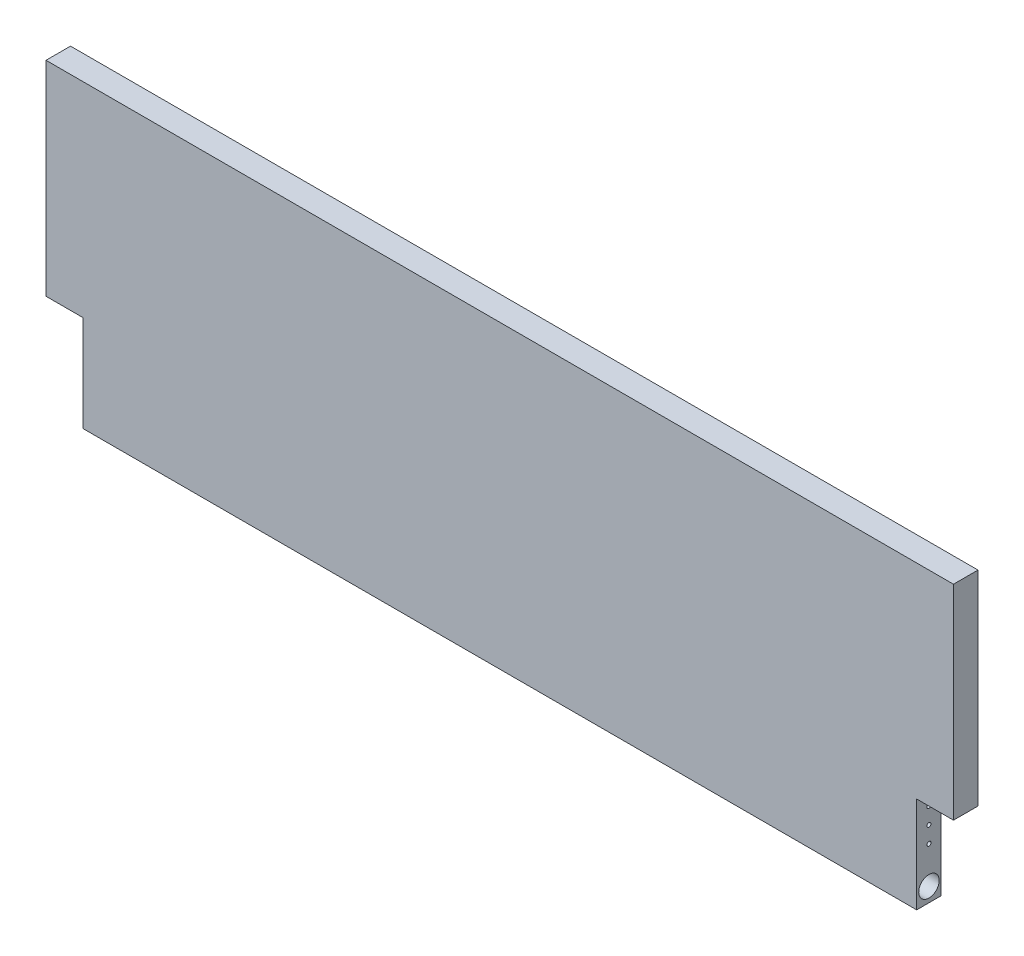
ISO-10303-21;
HEADER;
FILE_DESCRIPTION(('STEP AP214'),'2;1');
FILE_NAME('part.step','',(''),(''),'','','');
FILE_SCHEMA(('AUTOMOTIVE_DESIGN { 1 0 10303 214 1 1 1 1 }'));
ENDSEC;
DATA;
#1=APPLICATION_CONTEXT('core data for automotive mechanical design processes');
#2=APPLICATION_PROTOCOL_DEFINITION('international standard','automotive_design',2000,#1);
#3=PRODUCT_CONTEXT('',#1,'mechanical');
#4=PRODUCT('Part','Part','',(#3));
#5=PRODUCT_RELATED_PRODUCT_CATEGORY('part','',(#4));
#6=PRODUCT_DEFINITION_FORMATION('','',#4);
#7=PRODUCT_DEFINITION_CONTEXT('part definition',#1,'design');
#8=PRODUCT_DEFINITION('design','',#6,#7);
#9=PRODUCT_DEFINITION_SHAPE('','',#8);
#10=(LENGTH_UNIT() NAMED_UNIT(*) SI_UNIT(.MILLI.,.METRE.));
#11=(NAMED_UNIT(*) PLANE_ANGLE_UNIT() SI_UNIT($,.RADIAN.));
#12=(NAMED_UNIT(*) SI_UNIT($,.STERADIAN.) SOLID_ANGLE_UNIT());
#13=UNCERTAINTY_MEASURE_WITH_UNIT(LENGTH_MEASURE(1.E-05),#10,'distance_accuracy_value','');
#14=(GEOMETRIC_REPRESENTATION_CONTEXT(3) GLOBAL_UNCERTAINTY_ASSIGNED_CONTEXT((#13)) GLOBAL_UNIT_ASSIGNED_CONTEXT((#10,
#11,#12)) REPRESENTATION_CONTEXT('',''));
#15=CARTESIAN_POINT('',(0.,0.,0.));
#16=DIRECTION('',(0.,0.,1.));
#17=DIRECTION('',(1.,0.,0.));
#18=AXIS2_PLACEMENT_3D('',#15,#16,#17);
#19=CARTESIAN_POINT('',(102.,-3.5,3.));
#20=DIRECTION('',(0.,1.,0.));
#21=DIRECTION('',(0.,0.,1.));
#22=AXIS2_PLACEMENT_3D('',#19,#20,#21);
#23=PLANE('',#22);
#24=DIRECTION('',(0.,0.,-1.));
#25=VECTOR('',#24,1.);
#26=CARTESIAN_POINT('',(-102.,-3.5,3.));
#27=LINE('',#26,#25);
#28=CARTESIAN_POINT('',(-102.,-3.5,3.));
#29=VERTEX_POINT('',#28);
#30=CARTESIAN_POINT('',(-102.,-3.5,-3.));
#31=VERTEX_POINT('',#30);
#32=EDGE_CURVE('E165',#29,#31,#27,.T.);
#33=ORIENTED_EDGE('',*,*,#32,.T.);
#34=DIRECTION('',(-1.,0.,0.));
#35=VECTOR('',#34,1.);
#36=CARTESIAN_POINT('',(102.,-3.5,-3.));
#37=LINE('',#36,#35);
#38=CARTESIAN_POINT('',(102.,-3.5,-3.));
#39=VERTEX_POINT('',#38);
#40=EDGE_CURVE('E40',#39,#31,#37,.T.);
#41=ORIENTED_EDGE('',*,*,#40,.F.);
#42=DIRECTION('',(0.,0.,-1.));
#43=VECTOR('',#42,1.);
#44=CARTESIAN_POINT('',(102.,-3.5,3.));
#45=LINE('',#44,#43);
#46=CARTESIAN_POINT('',(102.,-3.5,3.));
#47=VERTEX_POINT('',#46);
#48=EDGE_CURVE('E171',#47,#39,#45,.T.);
#49=ORIENTED_EDGE('',*,*,#48,.F.);
#50=DIRECTION('',(-1.,0.,0.));
#51=VECTOR('',#50,1.);
#52=CARTESIAN_POINT('',(102.,-3.5,3.));
#53=LINE('',#52,#51);
#54=EDGE_CURVE('E11',#47,#29,#53,.T.);
#55=ORIENTED_EDGE('',*,*,#54,.T.);
#56=EDGE_LOOP('',(#33,#41,#49,#55));
#57=FACE_BOUND('',#56,.T.);
#58=ADVANCED_FACE('F33',(#57),#23,.F.);
#59=CARTESIAN_POINT('',(102.,0.,-3.));
#60=DIRECTION('',(0.,0.,1.));
#61=DIRECTION('',(0.,-1.,0.));
#62=AXIS2_PLACEMENT_3D('',#59,#60,#61);
#63=PLANE('',#62);
#64=DIRECTION('',(0.,1.,0.));
#65=VECTOR('',#64,1.);
#66=CARTESIAN_POINT('',(-102.,0.,-3.));
#67=LINE('',#66,#65);
#68=CARTESIAN_POINT('',(-102.,20.,-3.));
#69=VERTEX_POINT('',#68);
#70=EDGE_CURVE('E177',#31,#69,#67,.T.);
#71=ORIENTED_EDGE('',*,*,#70,.T.);
#72=DIRECTION('',(-1.,0.,0.));
#73=VECTOR('',#72,1.);
#74=CARTESIAN_POINT('',(-102.,20.,-3.));
#75=LINE('',#74,#73);
#76=CARTESIAN_POINT('',(-111.,20.,-3.));
#77=VERTEX_POINT('',#76);
#78=EDGE_CURVE('E55',#69,#77,#75,.T.);
#79=ORIENTED_EDGE('',*,*,#78,.T.);
#80=DIRECTION('',(0.,1.,0.));
#81=VECTOR('',#80,1.);
#82=CARTESIAN_POINT('',(-111.,70.,-2.99999999999999));
#83=LINE('',#82,#81);
#84=CARTESIAN_POINT('',(-111.,70.,-2.99999999999999));
#85=VERTEX_POINT('',#84);
#86=EDGE_CURVE('E158',#77,#85,#83,.T.);
#87=ORIENTED_EDGE('',*,*,#86,.T.);
#88=DIRECTION('',(-1.,0.,0.));
#89=VECTOR('',#88,1.);
#90=CARTESIAN_POINT('',(102.,70.,-2.99999999999999));
#91=LINE('',#90,#89);
#92=CARTESIAN_POINT('',(111.,70.,-2.99999999999999));
#93=VERTEX_POINT('',#92);
#94=EDGE_CURVE('E107',#93,#85,#91,.T.);
#95=ORIENTED_EDGE('',*,*,#94,.F.);
#96=DIRECTION('',(0.,1.,0.));
#97=VECTOR('',#96,1.);
#98=CARTESIAN_POINT('',(111.,70.,-2.99999999999999));
#99=LINE('',#98,#97);
#100=CARTESIAN_POINT('',(111.,20.,-3.));
#101=VERTEX_POINT('',#100);
#102=EDGE_CURVE('E123',#101,#93,#99,.T.);
#103=ORIENTED_EDGE('',*,*,#102,.F.);
#104=DIRECTION('',(1.,0.,0.));
#105=VECTOR('',#104,1.);
#106=CARTESIAN_POINT('',(102.,20.,-3.));
#107=LINE('',#106,#105);
#108=CARTESIAN_POINT('',(102.,20.,-3.));
#109=VERTEX_POINT('',#108);
#110=EDGE_CURVE('E118',#109,#101,#107,.T.);
#111=ORIENTED_EDGE('',*,*,#110,.F.);
#112=DIRECTION('',(0.,1.,0.));
#113=VECTOR('',#112,1.);
#114=CARTESIAN_POINT('',(102.,0.,-3.));
#115=LINE('',#114,#113);
#116=EDGE_CURVE('E108',#39,#109,#115,.T.);
#117=ORIENTED_EDGE('',*,*,#116,.F.);
#118=ORIENTED_EDGE('',*,*,#40,.T.);
#119=EDGE_LOOP('',(#71,#79,#87,#95,#103,#111,#117,#118));
#120=FACE_BOUND('',#119,.T.);
#121=ADVANCED_FACE('F185',(#120),#63,.F.);
#122=CARTESIAN_POINT('',(102.,70.,3.));
#123=DIRECTION('',(0.,-1.,0.));
#124=DIRECTION('',(0.,0.,-1.));
#125=AXIS2_PLACEMENT_3D('',#122,#123,#124);
#126=PLANE('',#125);
#127=ORIENTED_EDGE('',*,*,#94,.T.);
#128=DIRECTION('',(0.,0.,-1.));
#129=VECTOR('',#128,1.);
#130=CARTESIAN_POINT('',(-111.,70.,3.00000000000001));
#131=LINE('',#130,#129);
#132=CARTESIAN_POINT('',(-111.,70.,3.00000000000001));
#133=VERTEX_POINT('',#132);
#134=EDGE_CURVE('E103',#133,#85,#131,.T.);
#135=ORIENTED_EDGE('',*,*,#134,.F.);
#136=DIRECTION('',(-1.,0.,0.));
#137=VECTOR('',#136,1.);
#138=CARTESIAN_POINT('',(102.,70.,3.));
#139=LINE('',#138,#137);
#140=CARTESIAN_POINT('',(111.,70.,3.00000000000001));
#141=VERTEX_POINT('',#140);
#142=EDGE_CURVE('E97',#141,#133,#139,.T.);
#143=ORIENTED_EDGE('',*,*,#142,.F.);
#144=DIRECTION('',(0.,0.,-1.));
#145=VECTOR('',#144,1.);
#146=CARTESIAN_POINT('',(111.,70.,3.00000000000001));
#147=LINE('',#146,#145);
#148=EDGE_CURVE('E101',#141,#93,#147,.T.);
#149=ORIENTED_EDGE('',*,*,#148,.T.);
#150=EDGE_LOOP('',(#127,#135,#143,#149));
#151=FACE_BOUND('',#150,.T.);
#152=ADVANCED_FACE('F99',(#151),#126,.F.);
#153=CARTESIAN_POINT('',(102.,0.,3.));
#154=DIRECTION('',(0.,0.,-1.));
#155=DIRECTION('',(0.,1.,0.));
#156=AXIS2_PLACEMENT_3D('',#153,#154,#155);
#157=PLANE('',#156);
#158=ORIENTED_EDGE('',*,*,#142,.T.);
#159=DIRECTION('',(0.,1.,0.));
#160=VECTOR('',#159,1.);
#161=CARTESIAN_POINT('',(-111.,70.,3.00000000000001));
#162=LINE('',#161,#160);
#163=CARTESIAN_POINT('',(-111.,20.,3.));
#164=VERTEX_POINT('',#163);
#165=EDGE_CURVE('E157',#164,#133,#162,.T.);
#166=ORIENTED_EDGE('',*,*,#165,.F.);
#167=DIRECTION('',(-1.,0.,0.));
#168=VECTOR('',#167,1.);
#169=CARTESIAN_POINT('',(-102.,20.,3.));
#170=LINE('',#169,#168);
#171=CARTESIAN_POINT('',(-102.,20.,3.));
#172=VERTEX_POINT('',#171);
#173=EDGE_CURVE('E154',#172,#164,#170,.T.);
#174=ORIENTED_EDGE('',*,*,#173,.F.);
#175=DIRECTION('',(0.,-1.,0.));
#176=VECTOR('',#175,1.);
#177=CARTESIAN_POINT('',(-102.,0.,3.));
#178=LINE('',#177,#176);
#179=EDGE_CURVE('E172',#172,#29,#178,.T.);
#180=ORIENTED_EDGE('',*,*,#179,.T.);
#181=ORIENTED_EDGE('',*,*,#54,.F.);
#182=DIRECTION('',(0.,-1.,0.));
#183=VECTOR('',#182,1.);
#184=CARTESIAN_POINT('',(102.,0.,3.));
#185=LINE('',#184,#183);
#186=CARTESIAN_POINT('',(102.,20.,3.00000000000001));
#187=VERTEX_POINT('',#186);
#188=EDGE_CURVE('E169',#187,#47,#185,.T.);
#189=ORIENTED_EDGE('',*,*,#188,.F.);
#190=DIRECTION('',(1.,0.,0.));
#191=VECTOR('',#190,1.);
#192=CARTESIAN_POINT('',(102.,20.,3.));
#193=LINE('',#192,#191);
#194=CARTESIAN_POINT('',(111.,20.,3.));
#195=VERTEX_POINT('',#194);
#196=EDGE_CURVE('E114',#187,#195,#193,.T.);
#197=ORIENTED_EDGE('',*,*,#196,.T.);
#198=DIRECTION('',(0.,1.,0.));
#199=VECTOR('',#198,1.);
#200=CARTESIAN_POINT('',(111.,70.,3.00000000000001));
#201=LINE('',#200,#199);
#202=EDGE_CURVE('E111',#195,#141,#201,.T.);
#203=ORIENTED_EDGE('',*,*,#202,.T.);
#204=EDGE_LOOP('',(#158,#166,#174,#180,#181,#189,#197,#203));
#205=FACE_BOUND('',#204,.T.);
#206=ADVANCED_FACE('F112',(#205),#157,.F.);
#207=CARTESIAN_POINT('',(102.,0.,0.));
#208=DIRECTION('',(1.,0.,0.));
#209=DIRECTION('',(0.,0.,-1.));
#210=AXIS2_PLACEMENT_3D('',#207,#208,#209);
#211=PLANE('',#210);
#212=CARTESIAN_POINT('',(102.,17.,0.));
#213=DIRECTION('',(-1.,0.,0.));
#214=DIRECTION('',(0.,0.,1.));
#215=AXIS2_PLACEMENT_3D('',#212,#213,#214);
#216=CIRCLE('',#215,0.5);
#217=CARTESIAN_POINT('',(102.,17.,0.5));
#218=VERTEX_POINT('',#217);
#219=EDGE_CURVE('E203',#218,#218,#216,.T.);
#220=ORIENTED_EDGE('',*,*,#219,.T.);
#221=EDGE_LOOP('',(#220));
#222=FACE_BOUND('',#221,.T.);
#223=CARTESIAN_POINT('',(102.,13.,0.));
#224=DIRECTION('',(-1.,0.,0.));
#225=DIRECTION('',(0.,0.,1.));
#226=AXIS2_PLACEMENT_3D('',#223,#224,#225);
#227=CIRCLE('',#226,0.500000000000002);
#228=CARTESIAN_POINT('',(102.,13.,0.500000000000017));
#229=VERTEX_POINT('',#228);
#230=EDGE_CURVE('E414',#229,#229,#227,.T.);
#231=ORIENTED_EDGE('',*,*,#230,.T.);
#232=EDGE_LOOP('',(#231));
#233=FACE_BOUND('',#232,.T.);
#234=CARTESIAN_POINT('',(102.,9.,0.));
#235=DIRECTION('',(-1.,0.,0.));
#236=DIRECTION('',(0.,0.,1.));
#237=AXIS2_PLACEMENT_3D('',#234,#235,#236);
#238=CIRCLE('',#237,0.500000000000002);
#239=CARTESIAN_POINT('',(102.,9.,0.500000000000027));
#240=VERTEX_POINT('',#239);
#241=EDGE_CURVE('E422',#240,#240,#238,.T.);
#242=ORIENTED_EDGE('',*,*,#241,.T.);
#243=EDGE_LOOP('',(#242));
#244=FACE_BOUND('',#243,.T.);
#245=CARTESIAN_POINT('',(102.,0.,0.));
#246=DIRECTION('',(-1.,0.,0.));
#247=DIRECTION('',(0.,0.,1.));
#248=AXIS2_PLACEMENT_3D('',#245,#246,#247);
#249=CIRCLE('',#248,2.5);
#250=CARTESIAN_POINT('',(102.,0.,2.5));
#251=VERTEX_POINT('',#250);
#252=EDGE_CURVE('E428',#251,#251,#249,.T.);
#253=ORIENTED_EDGE('',*,*,#252,.T.);
#254=EDGE_LOOP('',(#253));
#255=FACE_BOUND('',#254,.T.);
#256=DIRECTION('',(0.,0.,-1.));
#257=VECTOR('',#256,1.);
#258=CARTESIAN_POINT('',(102.,20.,3.));
#259=LINE('',#258,#257);
#260=EDGE_CURVE('E47',#187,#109,#259,.T.);
#261=ORIENTED_EDGE('',*,*,#260,.F.);
#262=ORIENTED_EDGE('',*,*,#188,.T.);
#263=ORIENTED_EDGE('',*,*,#48,.T.);
#264=ORIENTED_EDGE('',*,*,#116,.T.);
#265=EDGE_LOOP('',(#261,#262,#263,#264));
#266=FACE_BOUND('',#265,.T.);
#267=ADVANCED_FACE('F231',(#222,#233,#244,#255,#266),#211,.T.);
#268=CARTESIAN_POINT('',(-102.,0.,0.));
#269=DIRECTION('',(1.,0.,0.));
#270=DIRECTION('',(0.,0.,-1.));
#271=AXIS2_PLACEMENT_3D('',#268,#269,#270);
#272=PLANE('',#271);
#273=CARTESIAN_POINT('',(-102.,17.,0.));
#274=DIRECTION('',(-1.,0.,0.));
#275=DIRECTION('',(0.,0.,1.));
#276=AXIS2_PLACEMENT_3D('',#273,#274,#275);
#277=CIRCLE('',#276,0.5);
#278=CARTESIAN_POINT('',(-102.,17.,0.5));
#279=VERTEX_POINT('',#278);
#280=EDGE_CURVE('E133',#279,#279,#277,.T.);
#281=ORIENTED_EDGE('',*,*,#280,.F.);
#282=EDGE_LOOP('',(#281));
#283=FACE_BOUND('',#282,.T.);
#284=CARTESIAN_POINT('',(-102.,13.,0.));
#285=DIRECTION('',(-1.,0.,0.));
#286=DIRECTION('',(0.,0.,1.));
#287=AXIS2_PLACEMENT_3D('',#284,#285,#286);
#288=CIRCLE('',#287,0.500000000000002);
#289=CARTESIAN_POINT('',(-102.,13.,0.500000000000017));
#290=VERTEX_POINT('',#289);
#291=EDGE_CURVE('E139',#290,#290,#288,.T.);
#292=ORIENTED_EDGE('',*,*,#291,.F.);
#293=EDGE_LOOP('',(#292));
#294=FACE_BOUND('',#293,.T.);
#295=CARTESIAN_POINT('',(-102.,9.,0.));
#296=DIRECTION('',(-1.,0.,0.));
#297=DIRECTION('',(0.,0.,1.));
#298=AXIS2_PLACEMENT_3D('',#295,#296,#297);
#299=CIRCLE('',#298,0.500000000000002);
#300=CARTESIAN_POINT('',(-102.,9.,0.500000000000027));
#301=VERTEX_POINT('',#300);
#302=EDGE_CURVE('E145',#301,#301,#299,.T.);
#303=ORIENTED_EDGE('',*,*,#302,.F.);
#304=EDGE_LOOP('',(#303));
#305=FACE_BOUND('',#304,.T.);
#306=CARTESIAN_POINT('',(-102.,0.,0.));
#307=DIRECTION('',(-1.,0.,0.));
#308=DIRECTION('',(0.,0.,1.));
#309=AXIS2_PLACEMENT_3D('',#306,#307,#308);
#310=CIRCLE('',#309,2.5);
#311=CARTESIAN_POINT('',(-102.,0.,2.5));
#312=VERTEX_POINT('',#311);
#313=EDGE_CURVE('E151',#312,#312,#310,.T.);
#314=ORIENTED_EDGE('',*,*,#313,.F.);
#315=EDGE_LOOP('',(#314));
#316=FACE_BOUND('',#315,.T.);
#317=ORIENTED_EDGE('',*,*,#179,.F.);
#318=DIRECTION('',(0.,0.,-1.));
#319=VECTOR('',#318,1.);
#320=CARTESIAN_POINT('',(-102.,20.,3.));
#321=LINE('',#320,#319);
#322=EDGE_CURVE('E160',#172,#69,#321,.T.);
#323=ORIENTED_EDGE('',*,*,#322,.T.);
#324=ORIENTED_EDGE('',*,*,#70,.F.);
#325=ORIENTED_EDGE('',*,*,#32,.F.);
#326=EDGE_LOOP('',(#317,#323,#324,#325));
#327=FACE_BOUND('',#326,.T.);
#328=ADVANCED_FACE('F193',(#283,#294,#305,#316,#327),#272,.F.);
#329=CARTESIAN_POINT('',(-111.,70.,3.00000000000001));
#330=DIRECTION('',(-1.,0.,0.));
#331=DIRECTION('',(0.,0.,1.));
#332=AXIS2_PLACEMENT_3D('',#329,#330,#331);
#333=PLANE('',#332);
#334=ORIENTED_EDGE('',*,*,#86,.F.);
#335=DIRECTION('',(0.,0.,-1.));
#336=VECTOR('',#335,1.);
#337=CARTESIAN_POINT('',(-111.,20.,3.));
#338=LINE('',#337,#336);
#339=EDGE_CURVE('E166',#164,#77,#338,.T.);
#340=ORIENTED_EDGE('',*,*,#339,.F.);
#341=ORIENTED_EDGE('',*,*,#165,.T.);
#342=ORIENTED_EDGE('',*,*,#134,.T.);
#343=EDGE_LOOP('',(#334,#340,#341,#342));
#344=FACE_BOUND('',#343,.T.);
#345=ADVANCED_FACE('F198',(#344),#333,.T.);
#346=CARTESIAN_POINT('',(-102.,20.,3.));
#347=DIRECTION('',(0.,-1.,0.));
#348=DIRECTION('',(0.,0.,-1.));
#349=AXIS2_PLACEMENT_3D('',#346,#347,#348);
#350=PLANE('',#349);
#351=ORIENTED_EDGE('',*,*,#78,.F.);
#352=ORIENTED_EDGE('',*,*,#322,.F.);
#353=ORIENTED_EDGE('',*,*,#173,.T.);
#354=ORIENTED_EDGE('',*,*,#339,.T.);
#355=EDGE_LOOP('',(#351,#352,#353,#354));
#356=FACE_BOUND('',#355,.T.);
#357=ADVANCED_FACE('F195',(#356),#350,.T.);
#358=CARTESIAN_POINT('',(-92.,0.,0.));
#359=DIRECTION('',(-1.,0.,0.));
#360=DIRECTION('',(0.,0.,1.));
#361=AXIS2_PLACEMENT_3D('',#358,#359,#360);
#362=CYLINDRICAL_SURFACE('',#361,2.5);
#363=CARTESIAN_POINT('',(-92.,0.,0.));
#364=DIRECTION('',(-1.,0.,0.));
#365=DIRECTION('',(0.,0.,1.));
#366=AXIS2_PLACEMENT_3D('',#363,#364,#365);
#367=CIRCLE('',#366,2.5);
#368=CARTESIAN_POINT('',(-92.,0.,2.5));
#369=VERTEX_POINT('',#368);
#370=EDGE_CURVE('E148',#369,#369,#367,.T.);
#371=ORIENTED_EDGE('',*,*,#370,.F.);
#372=EDGE_LOOP('',(#371));
#373=FACE_BOUND('',#372,.T.);
#374=ORIENTED_EDGE('',*,*,#313,.T.);
#375=EDGE_LOOP('',(#374));
#376=FACE_BOUND('',#375,.T.);
#377=ADVANCED_FACE('F240',(#373,#376),#362,.F.);
#378=CARTESIAN_POINT('',(-92.,0.,0.));
#379=DIRECTION('',(-1.,0.,0.));
#380=DIRECTION('',(0.,0.,1.));
#381=AXIS2_PLACEMENT_3D('',#378,#379,#380);
#382=PLANE('',#381);
#383=ORIENTED_EDGE('',*,*,#370,.T.);
#384=EDGE_LOOP('',(#383));
#385=FACE_BOUND('',#384,.T.);
#386=ADVANCED_FACE('F245',(#385),#382,.T.);
#387=CARTESIAN_POINT('',(-92.,9.,0.));
#388=DIRECTION('',(-1.,0.,0.));
#389=DIRECTION('',(0.,0.,1.));
#390=AXIS2_PLACEMENT_3D('',#387,#388,#389);
#391=CYLINDRICAL_SURFACE('',#390,0.500000000000002);
#392=CARTESIAN_POINT('',(-92.,9.,0.));
#393=DIRECTION('',(-1.,0.,0.));
#394=DIRECTION('',(0.,0.,1.));
#395=AXIS2_PLACEMENT_3D('',#392,#393,#394);
#396=CIRCLE('',#395,0.500000000000002);
#397=CARTESIAN_POINT('',(-92.,9.,0.500000000000027));
#398=VERTEX_POINT('',#397);
#399=EDGE_CURVE('E142',#398,#398,#396,.T.);
#400=ORIENTED_EDGE('',*,*,#399,.F.);
#401=EDGE_LOOP('',(#400));
#402=FACE_BOUND('',#401,.T.);
#403=ORIENTED_EDGE('',*,*,#302,.T.);
#404=EDGE_LOOP('',(#403));
#405=FACE_BOUND('',#404,.T.);
#406=ADVANCED_FACE('F249',(#402,#405),#391,.F.);
#407=CARTESIAN_POINT('',(-92.,9.,0.));
#408=DIRECTION('',(-1.,0.,0.));
#409=DIRECTION('',(0.,0.,1.));
#410=AXIS2_PLACEMENT_3D('',#407,#408,#409);
#411=PLANE('',#410);
#412=ORIENTED_EDGE('',*,*,#399,.T.);
#413=EDGE_LOOP('',(#412));
#414=FACE_BOUND('',#413,.T.);
#415=ADVANCED_FACE('F253',(#414),#411,.T.);
#416=CARTESIAN_POINT('',(-92.,13.,0.));
#417=DIRECTION('',(-1.,0.,0.));
#418=DIRECTION('',(0.,0.,1.));
#419=AXIS2_PLACEMENT_3D('',#416,#417,#418);
#420=CYLINDRICAL_SURFACE('',#419,0.500000000000002);
#421=CARTESIAN_POINT('',(-92.,13.,0.));
#422=DIRECTION('',(-1.,0.,0.));
#423=DIRECTION('',(0.,0.,1.));
#424=AXIS2_PLACEMENT_3D('',#421,#422,#423);
#425=CIRCLE('',#424,0.500000000000002);
#426=CARTESIAN_POINT('',(-92.,13.,0.500000000000017));
#427=VERTEX_POINT('',#426);
#428=EDGE_CURVE('E136',#427,#427,#425,.T.);
#429=ORIENTED_EDGE('',*,*,#428,.F.);
#430=EDGE_LOOP('',(#429));
#431=FACE_BOUND('',#430,.T.);
#432=ORIENTED_EDGE('',*,*,#291,.T.);
#433=EDGE_LOOP('',(#432));
#434=FACE_BOUND('',#433,.T.);
#435=ADVANCED_FACE('F257',(#431,#434),#420,.F.);
#436=CARTESIAN_POINT('',(-92.,13.,0.));
#437=DIRECTION('',(-1.,0.,0.));
#438=DIRECTION('',(0.,0.,1.));
#439=AXIS2_PLACEMENT_3D('',#436,#437,#438);
#440=PLANE('',#439);
#441=ORIENTED_EDGE('',*,*,#428,.T.);
#442=EDGE_LOOP('',(#441));
#443=FACE_BOUND('',#442,.T.);
#444=ADVANCED_FACE('F261',(#443),#440,.T.);
#445=CARTESIAN_POINT('',(-92.,17.,0.));
#446=DIRECTION('',(-1.,0.,0.));
#447=DIRECTION('',(0.,0.,1.));
#448=AXIS2_PLACEMENT_3D('',#445,#446,#447);
#449=CYLINDRICAL_SURFACE('',#448,0.5);
#450=CARTESIAN_POINT('',(-92.,17.,0.));
#451=DIRECTION('',(-1.,0.,0.));
#452=DIRECTION('',(0.,0.,1.));
#453=AXIS2_PLACEMENT_3D('',#450,#451,#452);
#454=CIRCLE('',#453,0.5);
#455=CARTESIAN_POINT('',(-92.,17.,0.5));
#456=VERTEX_POINT('',#455);
#457=EDGE_CURVE('E130',#456,#456,#454,.T.);
#458=ORIENTED_EDGE('',*,*,#457,.F.);
#459=EDGE_LOOP('',(#458));
#460=FACE_BOUND('',#459,.T.);
#461=ORIENTED_EDGE('',*,*,#280,.T.);
#462=EDGE_LOOP('',(#461));
#463=FACE_BOUND('',#462,.T.);
#464=ADVANCED_FACE('F216',(#460,#463),#449,.F.);
#465=CARTESIAN_POINT('',(-92.,17.,0.));
#466=DIRECTION('',(-1.,0.,0.));
#467=DIRECTION('',(0.,0.,1.));
#468=AXIS2_PLACEMENT_3D('',#465,#466,#467);
#469=PLANE('',#468);
#470=ORIENTED_EDGE('',*,*,#457,.T.);
#471=EDGE_LOOP('',(#470));
#472=FACE_BOUND('',#471,.T.);
#473=ADVANCED_FACE('F208',(#472),#469,.T.);
#474=CARTESIAN_POINT('',(102.,20.,3.));
#475=DIRECTION('',(0.,1.,0.));
#476=DIRECTION('',(0.,0.,1.));
#477=AXIS2_PLACEMENT_3D('',#474,#475,#476);
#478=PLANE('',#477);
#479=ORIENTED_EDGE('',*,*,#110,.T.);
#480=DIRECTION('',(0.,0.,-1.));
#481=VECTOR('',#480,1.);
#482=CARTESIAN_POINT('',(111.,20.,3.));
#483=LINE('',#482,#481);
#484=EDGE_CURVE('E124',#195,#101,#483,.T.);
#485=ORIENTED_EDGE('',*,*,#484,.F.);
#486=ORIENTED_EDGE('',*,*,#196,.F.);
#487=ORIENTED_EDGE('',*,*,#260,.T.);
#488=EDGE_LOOP('',(#479,#485,#486,#487));
#489=FACE_BOUND('',#488,.T.);
#490=ADVANCED_FACE('F206',(#489),#478,.F.);
#491=CARTESIAN_POINT('',(111.,70.,3.00000000000001));
#492=DIRECTION('',(-1.,0.,0.));
#493=DIRECTION('',(0.,0.,1.));
#494=AXIS2_PLACEMENT_3D('',#491,#492,#493);
#495=PLANE('',#494);
#496=ORIENTED_EDGE('',*,*,#102,.T.);
#497=ORIENTED_EDGE('',*,*,#148,.F.);
#498=ORIENTED_EDGE('',*,*,#202,.F.);
#499=ORIENTED_EDGE('',*,*,#484,.T.);
#500=EDGE_LOOP('',(#496,#497,#498,#499));
#501=FACE_BOUND('',#500,.T.);
#502=ADVANCED_FACE('F121',(#501),#495,.F.);
#503=CARTESIAN_POINT('',(92.,0.,0.));
#504=DIRECTION('',(1.,0.,0.));
#505=DIRECTION('',(0.,0.,-1.));
#506=AXIS2_PLACEMENT_3D('',#503,#504,#505);
#507=CYLINDRICAL_SURFACE('',#506,2.5);
#508=CARTESIAN_POINT('',(92.,0.,0.));
#509=DIRECTION('',(-1.,0.,0.));
#510=DIRECTION('',(0.,0.,1.));
#511=AXIS2_PLACEMENT_3D('',#508,#509,#510);
#512=CIRCLE('',#511,2.5);
#513=CARTESIAN_POINT('',(92.,0.,2.5));
#514=VERTEX_POINT('',#513);
#515=EDGE_CURVE('E425',#514,#514,#512,.T.);
#516=ORIENTED_EDGE('',*,*,#515,.T.);
#517=EDGE_LOOP('',(#516));
#518=FACE_BOUND('',#517,.T.);
#519=ORIENTED_EDGE('',*,*,#252,.F.);
#520=EDGE_LOOP('',(#519));
#521=FACE_BOUND('',#520,.T.);
#522=ADVANCED_FACE('F214',(#518,#521),#507,.F.);
#523=CARTESIAN_POINT('',(92.,0.,0.));
#524=DIRECTION('',(1.,0.,0.));
#525=DIRECTION('',(0.,0.,1.));
#526=AXIS2_PLACEMENT_3D('',#523,#524,#525);
#527=PLANE('',#526);
#528=ORIENTED_EDGE('',*,*,#515,.F.);
#529=EDGE_LOOP('',(#528));
#530=FACE_BOUND('',#529,.T.);
#531=ADVANCED_FACE('F334',(#530),#527,.T.);
#532=CARTESIAN_POINT('',(92.,9.,0.));
#533=DIRECTION('',(1.,0.,0.));
#534=DIRECTION('',(0.,0.,-1.));
#535=AXIS2_PLACEMENT_3D('',#532,#533,#534);
#536=CYLINDRICAL_SURFACE('',#535,0.500000000000002);
#537=CARTESIAN_POINT('',(92.,9.,0.));
#538=DIRECTION('',(-1.,0.,0.));
#539=DIRECTION('',(0.,0.,1.));
#540=AXIS2_PLACEMENT_3D('',#537,#538,#539);
#541=CIRCLE('',#540,0.500000000000002);
#542=CARTESIAN_POINT('',(92.,9.,0.500000000000027));
#543=VERTEX_POINT('',#542);
#544=EDGE_CURVE('E419',#543,#543,#541,.T.);
#545=ORIENTED_EDGE('',*,*,#544,.T.);
#546=EDGE_LOOP('',(#545));
#547=FACE_BOUND('',#546,.T.);
#548=ORIENTED_EDGE('',*,*,#241,.F.);
#549=EDGE_LOOP('',(#548));
#550=FACE_BOUND('',#549,.T.);
#551=ADVANCED_FACE('F343',(#547,#550),#536,.F.);
#552=CARTESIAN_POINT('',(92.,9.,0.));
#553=DIRECTION('',(1.,0.,0.));
#554=DIRECTION('',(0.,0.,1.));
#555=AXIS2_PLACEMENT_3D('',#552,#553,#554);
#556=PLANE('',#555);
#557=ORIENTED_EDGE('',*,*,#544,.F.);
#558=EDGE_LOOP('',(#557));
#559=FACE_BOUND('',#558,.T.);
#560=ADVANCED_FACE('F353',(#559),#556,.T.);
#561=CARTESIAN_POINT('',(92.,13.,0.));
#562=DIRECTION('',(1.,0.,0.));
#563=DIRECTION('',(0.,0.,-1.));
#564=AXIS2_PLACEMENT_3D('',#561,#562,#563);
#565=CYLINDRICAL_SURFACE('',#564,0.500000000000002);
#566=CARTESIAN_POINT('',(92.,13.,0.));
#567=DIRECTION('',(-1.,0.,0.));
#568=DIRECTION('',(0.,0.,1.));
#569=AXIS2_PLACEMENT_3D('',#566,#567,#568);
#570=CIRCLE('',#569,0.500000000000002);
#571=CARTESIAN_POINT('',(92.,13.,0.500000000000017));
#572=VERTEX_POINT('',#571);
#573=EDGE_CURVE('E411',#572,#572,#570,.T.);
#574=ORIENTED_EDGE('',*,*,#573,.T.);
#575=EDGE_LOOP('',(#574));
#576=FACE_BOUND('',#575,.T.);
#577=ORIENTED_EDGE('',*,*,#230,.F.);
#578=EDGE_LOOP('',(#577));
#579=FACE_BOUND('',#578,.T.);
#580=ADVANCED_FACE('F363',(#576,#579),#565,.F.);
#581=CARTESIAN_POINT('',(92.,13.,0.));
#582=DIRECTION('',(1.,0.,0.));
#583=DIRECTION('',(0.,0.,1.));
#584=AXIS2_PLACEMENT_3D('',#581,#582,#583);
#585=PLANE('',#584);
#586=ORIENTED_EDGE('',*,*,#573,.F.);
#587=EDGE_LOOP('',(#586));
#588=FACE_BOUND('',#587,.T.);
#589=ADVANCED_FACE('F373',(#588),#585,.T.);
#590=CARTESIAN_POINT('',(92.,17.,0.));
#591=DIRECTION('',(1.,0.,0.));
#592=DIRECTION('',(0.,0.,-1.));
#593=AXIS2_PLACEMENT_3D('',#590,#591,#592);
#594=CYLINDRICAL_SURFACE('',#593,0.5);
#595=CARTESIAN_POINT('',(92.,17.,0.));
#596=DIRECTION('',(-1.,0.,0.));
#597=DIRECTION('',(0.,0.,1.));
#598=AXIS2_PLACEMENT_3D('',#595,#596,#597);
#599=CIRCLE('',#598,0.5);
#600=CARTESIAN_POINT('',(92.,17.,0.5));
#601=VERTEX_POINT('',#600);
#602=EDGE_CURVE('E199',#601,#601,#599,.T.);
#603=ORIENTED_EDGE('',*,*,#602,.T.);
#604=EDGE_LOOP('',(#603));
#605=FACE_BOUND('',#604,.T.);
#606=ORIENTED_EDGE('',*,*,#219,.F.);
#607=EDGE_LOOP('',(#606));
#608=FACE_BOUND('',#607,.T.);
#609=ADVANCED_FACE('F383',(#605,#608),#594,.F.);
#610=CARTESIAN_POINT('',(92.,17.,0.));
#611=DIRECTION('',(1.,0.,0.));
#612=DIRECTION('',(0.,0.,1.));
#613=AXIS2_PLACEMENT_3D('',#610,#611,#612);
#614=PLANE('',#613);
#615=ORIENTED_EDGE('',*,*,#602,.F.);
#616=EDGE_LOOP('',(#615));
#617=FACE_BOUND('',#616,.T.);
#618=ADVANCED_FACE('F393',(#617),#614,.T.);
#619=CLOSED_SHELL('',(#58,#121,#152,#206,#267,#328,#345,#357,#377,#386,#406,#415,#435,#444,#464,
#473,#490,#502,#522,#531,#551,#560,#580,#589,#609,#618));
#620=MANIFOLD_SOLID_BREP('B2',#619);
#621=ADVANCED_BREP_SHAPE_REPRESENTATION('',(#18,#620),#14);
#622=SHAPE_DEFINITION_REPRESENTATION(#9,#621);
ENDSEC;
END-ISO-10303-21;
